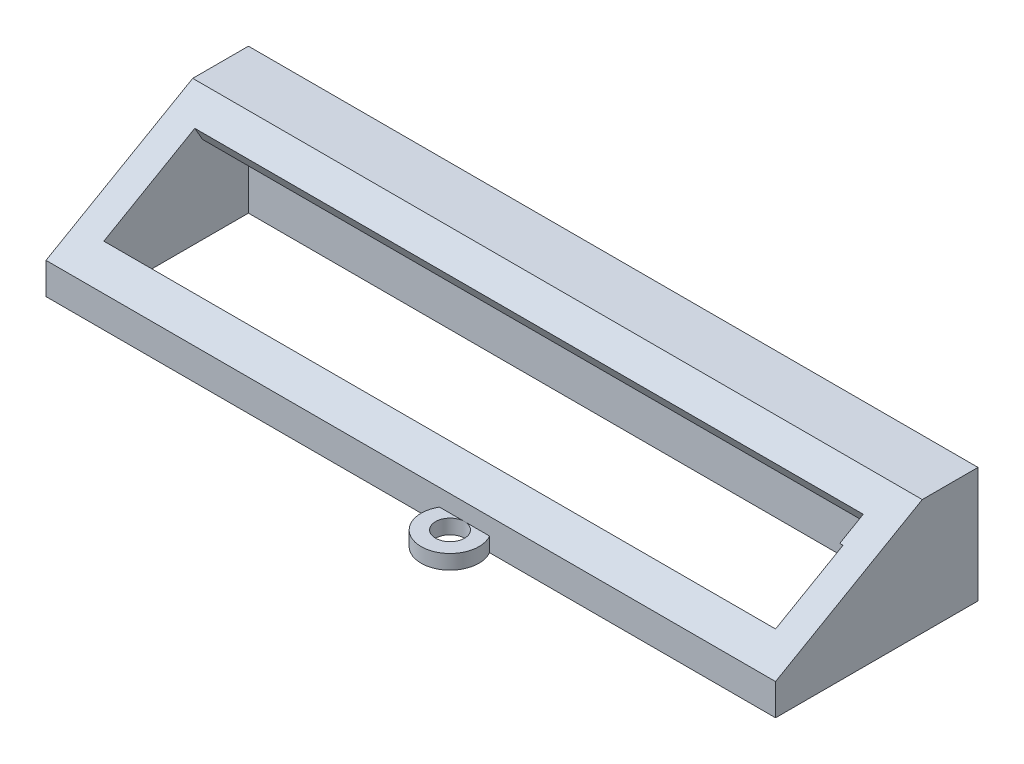
ISO-10303-21;
HEADER;
FILE_DESCRIPTION(('STEP AP214'),'2;1');
FILE_NAME('part.step','',(''),(''),'','','');
FILE_SCHEMA(('AUTOMOTIVE_DESIGN { 1 0 10303 214 1 1 1 1 }'));
ENDSEC;
DATA;
#1=APPLICATION_CONTEXT('core data for automotive mechanical design processes');
#2=APPLICATION_PROTOCOL_DEFINITION('international standard','automotive_design',2000,#1);
#3=PRODUCT_CONTEXT('',#1,'mechanical');
#4=PRODUCT('Part','Part','',(#3));
#5=PRODUCT_RELATED_PRODUCT_CATEGORY('part','',(#4));
#6=PRODUCT_DEFINITION_FORMATION('','',#4);
#7=PRODUCT_DEFINITION_CONTEXT('part definition',#1,'design');
#8=PRODUCT_DEFINITION('design','',#6,#7);
#9=PRODUCT_DEFINITION_SHAPE('','',#8);
#10=(LENGTH_UNIT() NAMED_UNIT(*) SI_UNIT(.MILLI.,.METRE.));
#11=(NAMED_UNIT(*) PLANE_ANGLE_UNIT() SI_UNIT($,.RADIAN.));
#12=(NAMED_UNIT(*) SI_UNIT($,.STERADIAN.) SOLID_ANGLE_UNIT());
#13=UNCERTAINTY_MEASURE_WITH_UNIT(LENGTH_MEASURE(1.E-05),#10,'distance_accuracy_value','');
#14=(GEOMETRIC_REPRESENTATION_CONTEXT(3) GLOBAL_UNCERTAINTY_ASSIGNED_CONTEXT((#13)) GLOBAL_UNIT_ASSIGNED_CONTEXT((#10,
#11,#12)) REPRESENTATION_CONTEXT('',''));
#15=CARTESIAN_POINT('',(0.,0.,0.));
#16=DIRECTION('',(0.,0.,1.));
#17=DIRECTION('',(1.,0.,0.));
#18=AXIS2_PLACEMENT_3D('',#15,#16,#17);
#19=CARTESIAN_POINT('',(252.27,80.,-70.));
#20=DIRECTION('',(-1.,0.,0.));
#21=DIRECTION('',(0.,0.,1.));
#22=AXIS2_PLACEMENT_3D('',#19,#20,#21);
#23=PLANE('',#22);
#24=DIRECTION('',(0.,0.,-1.));
#25=VECTOR('',#24,1.);
#26=CARTESIAN_POINT('',(252.27,80.,-70.));
#27=LINE('',#26,#25);
#28=CARTESIAN_POINT('',(252.27,80.,-31.4570736418901));
#29=VERTEX_POINT('',#28);
#30=CARTESIAN_POINT('',(252.27,80.,-70.));
#31=VERTEX_POINT('',#30);
#32=EDGE_CURVE('E214',#29,#31,#27,.T.);
#33=ORIENTED_EDGE('',*,*,#32,.F.);
#34=DIRECTION('',(0.,0.498039271037889,-0.86715447557171));
#35=VECTOR('',#34,1.);
#36=CARTESIAN_POINT('',(252.27,21.729405288567,70.));
#37=LINE('',#36,#35);
#38=CARTESIAN_POINT('',(252.27,21.729405288567,70.));
#39=VERTEX_POINT('',#38);
#40=EDGE_CURVE('E168',#39,#29,#37,.T.);
#41=ORIENTED_EDGE('',*,*,#40,.F.);
#42=DIRECTION('',(0.,-1.,0.));
#43=VECTOR('',#42,1.);
#44=CARTESIAN_POINT('',(252.27,80.,70.));
#45=LINE('',#44,#43);
#46=CARTESIAN_POINT('',(252.27,0.,70.));
#47=VERTEX_POINT('',#46);
#48=EDGE_CURVE('E222',#39,#47,#45,.T.);
#49=ORIENTED_EDGE('',*,*,#48,.T.);
#50=DIRECTION('',(0.,0.,-1.));
#51=VECTOR('',#50,1.);
#52=CARTESIAN_POINT('',(252.27,0.,-70.));
#53=LINE('',#52,#51);
#54=CARTESIAN_POINT('',(252.27,0.,-70.));
#55=VERTEX_POINT('',#54);
#56=EDGE_CURVE('E207',#47,#55,#53,.T.);
#57=ORIENTED_EDGE('',*,*,#56,.T.);
#58=DIRECTION('',(0.,-1.,0.));
#59=VECTOR('',#58,1.);
#60=CARTESIAN_POINT('',(252.27,80.,-70.));
#61=LINE('',#60,#59);
#62=EDGE_CURVE('E239',#31,#55,#61,.T.);
#63=ORIENTED_EDGE('',*,*,#62,.F.);
#64=EDGE_LOOP('',(#33,#41,#49,#57,#63));
#65=FACE_BOUND('',#64,.T.);
#66=ADVANCED_FACE('F39',(#65),#23,.F.);
#67=CARTESIAN_POINT('',(-252.27,80.,-70.));
#68=DIRECTION('',(0.,0.,1.));
#69=DIRECTION('',(1.,0.,0.));
#70=AXIS2_PLACEMENT_3D('',#67,#68,#69);
#71=PLANE('',#70);
#72=DIRECTION('',(-1.,0.,0.));
#73=VECTOR('',#72,1.);
#74=CARTESIAN_POINT('',(-252.27,0.,-70.));
#75=LINE('',#74,#73);
#76=CARTESIAN_POINT('',(-252.27,0.,-70.));
#77=VERTEX_POINT('',#76);
#78=EDGE_CURVE('E225',#55,#77,#75,.T.);
#79=ORIENTED_EDGE('',*,*,#78,.T.);
#80=DIRECTION('',(0.,-1.,0.));
#81=VECTOR('',#80,1.);
#82=CARTESIAN_POINT('',(-252.27,80.,-70.));
#83=LINE('',#82,#81);
#84=CARTESIAN_POINT('',(-252.27,80.,-70.));
#85=VERTEX_POINT('',#84);
#86=EDGE_CURVE('E236',#85,#77,#83,.T.);
#87=ORIENTED_EDGE('',*,*,#86,.F.);
#88=DIRECTION('',(-1.,0.,0.));
#89=VECTOR('',#88,1.);
#90=CARTESIAN_POINT('',(-252.27,80.,-70.));
#91=LINE('',#90,#89);
#92=EDGE_CURVE('E216',#31,#85,#91,.T.);
#93=ORIENTED_EDGE('',*,*,#92,.F.);
#94=ORIENTED_EDGE('',*,*,#62,.T.);
#95=EDGE_LOOP('',(#79,#87,#93,#94));
#96=FACE_BOUND('',#95,.T.);
#97=ADVANCED_FACE('F284',(#96),#71,.F.);
#98=CARTESIAN_POINT('',(-252.27,80.,-70.));
#99=DIRECTION('',(1.,0.,0.));
#100=DIRECTION('',(0.,0.,-1.));
#101=AXIS2_PLACEMENT_3D('',#98,#99,#100);
#102=PLANE('',#101);
#103=DIRECTION('',(0.,-1.,0.));
#104=VECTOR('',#103,1.);
#105=CARTESIAN_POINT('',(-252.27,80.,70.));
#106=LINE('',#105,#104);
#107=CARTESIAN_POINT('',(-252.27,21.729405288567,70.));
#108=VERTEX_POINT('',#107);
#109=CARTESIAN_POINT('',(-252.27,0.,70.));
#110=VERTEX_POINT('',#109);
#111=EDGE_CURVE('E234',#108,#110,#106,.T.);
#112=ORIENTED_EDGE('',*,*,#111,.F.);
#113=DIRECTION('',(0.,0.498039271037889,-0.86715447557171));
#114=VECTOR('',#113,1.);
#115=CARTESIAN_POINT('',(-252.27,21.729405288567,70.));
#116=LINE('',#115,#114);
#117=CARTESIAN_POINT('',(-252.27,80.,-31.4570736418901));
#118=VERTEX_POINT('',#117);
#119=EDGE_CURVE('E169',#108,#118,#116,.T.);
#120=ORIENTED_EDGE('',*,*,#119,.T.);
#121=DIRECTION('',(0.,0.,1.));
#122=VECTOR('',#121,1.);
#123=CARTESIAN_POINT('',(-252.27,80.,-70.));
#124=LINE('',#123,#122);
#125=EDGE_CURVE('E219',#85,#118,#124,.T.);
#126=ORIENTED_EDGE('',*,*,#125,.F.);
#127=ORIENTED_EDGE('',*,*,#86,.T.);
#128=DIRECTION('',(0.,0.,1.));
#129=VECTOR('',#128,1.);
#130=CARTESIAN_POINT('',(-252.27,0.,-70.));
#131=LINE('',#130,#129);
#132=EDGE_CURVE('E227',#77,#110,#131,.T.);
#133=ORIENTED_EDGE('',*,*,#132,.T.);
#134=EDGE_LOOP('',(#112,#120,#126,#127,#133));
#135=FACE_BOUND('',#134,.T.);
#136=ADVANCED_FACE('F279',(#135),#102,.F.);
#137=CARTESIAN_POINT('',(-252.27,80.,70.));
#138=DIRECTION('',(0.,0.,-1.));
#139=DIRECTION('',(-1.,0.,0.));
#140=AXIS2_PLACEMENT_3D('',#137,#138,#139);
#141=PLANE('',#140);
#142=DIRECTION('',(-1.,0.,0.));
#143=VECTOR('',#142,1.);
#144=CARTESIAN_POINT('',(-252.27,9.99999999999999,70.));
#145=LINE('',#144,#143);
#146=CARTESIAN_POINT('',(54.4822492060079,10.,70.));
#147=VERTEX_POINT('',#146);
#148=CARTESIAN_POINT('',(37.1617411303191,10.,70.));
#149=VERTEX_POINT('',#148);
#150=EDGE_CURVE('E12',#147,#149,#145,.T.);
#151=ORIENTED_EDGE('',*,*,#150,.F.);
#152=DIRECTION('',(0.,-1.,0.));
#153=VECTOR('',#152,1.);
#154=CARTESIAN_POINT('',(54.4822492060079,10.,70.));
#155=LINE('',#154,#153);
#156=CARTESIAN_POINT('',(54.4822492060079,0.,70.));
#157=VERTEX_POINT('',#156);
#158=EDGE_CURVE('E156',#147,#157,#155,.T.);
#159=ORIENTED_EDGE('',*,*,#158,.T.);
#160=DIRECTION('',(1.,0.,0.));
#161=VECTOR('',#160,1.);
#162=CARTESIAN_POINT('',(-252.27,0.,70.));
#163=LINE('',#162,#161);
#164=EDGE_CURVE('E230',#157,#47,#163,.T.);
#165=ORIENTED_EDGE('',*,*,#164,.T.);
#166=ORIENTED_EDGE('',*,*,#48,.F.);
#167=DIRECTION('',(1.,0.,0.));
#168=VECTOR('',#167,1.);
#169=CARTESIAN_POINT('',(-252.27,21.729405288567,70.));
#170=LINE('',#169,#168);
#171=EDGE_CURVE('E172',#108,#39,#170,.T.);
#172=ORIENTED_EDGE('',*,*,#171,.F.);
#173=ORIENTED_EDGE('',*,*,#111,.T.);
#174=CARTESIAN_POINT('',(19.8412330546303,0.,70.));
#175=VERTEX_POINT('',#174);
#176=EDGE_CURVE('E217',#110,#175,#163,.T.);
#177=ORIENTED_EDGE('',*,*,#176,.T.);
#178=DIRECTION('',(0.,-1.,0.));
#179=VECTOR('',#178,1.);
#180=CARTESIAN_POINT('',(19.8412330546303,10.,70.));
#181=LINE('',#180,#179);
#182=CARTESIAN_POINT('',(19.8412330546303,10.,70.));
#183=VERTEX_POINT('',#182);
#184=EDGE_CURVE('E57',#175,#183,#181,.F.);
#185=ORIENTED_EDGE('',*,*,#184,.T.);
#186=EDGE_CURVE('E42',#149,#183,#145,.T.);
#187=ORIENTED_EDGE('',*,*,#186,.F.);
#188=EDGE_LOOP('',(#151,#159,#165,#166,#172,#173,#177,#185,#187));
#189=FACE_BOUND('',#188,.T.);
#190=ADVANCED_FACE('F263',(#189),#141,.F.);
#191=CARTESIAN_POINT('',(0.,80.,0.));
#192=DIRECTION('',(0.,1.,0.));
#193=DIRECTION('',(0.,0.,1.));
#194=AXIS2_PLACEMENT_3D('',#191,#192,#193);
#195=PLANE('',#194);
#196=DIRECTION('',(1.,0.,0.));
#197=VECTOR('',#196,1.);
#198=CARTESIAN_POINT('',(-252.27,80.,-31.4570736418901));
#199=LINE('',#198,#197);
#200=EDGE_CURVE('E174',#118,#29,#199,.T.);
#201=ORIENTED_EDGE('',*,*,#200,.T.);
#202=ORIENTED_EDGE('',*,*,#32,.T.);
#203=ORIENTED_EDGE('',*,*,#92,.T.);
#204=ORIENTED_EDGE('',*,*,#125,.T.);
#205=EDGE_LOOP('',(#201,#202,#203,#204));
#206=FACE_BOUND('',#205,.T.);
#207=ADVANCED_FACE('F286',(#206),#195,.T.);
#208=CARTESIAN_POINT('',(0.,0.,0.));
#209=DIRECTION('',(0.,1.,0.));
#210=DIRECTION('',(0.,0.,1.));
#211=AXIS2_PLACEMENT_3D('',#208,#209,#210);
#212=PLANE('',#211);
#213=ORIENTED_EDGE('',*,*,#164,.F.);
#214=CARTESIAN_POINT('',(37.1617411303191,0.,80.));
#215=DIRECTION('',(0.,-1.,0.));
#216=DIRECTION('',(1.,0.,0.));
#217=AXIS2_PLACEMENT_3D('',#214,#215,#216);
#218=CIRCLE('',#217,20.);
#219=EDGE_CURVE('E255',#157,#175,#218,.T.);
#220=ORIENTED_EDGE('',*,*,#219,.T.);
#221=ORIENTED_EDGE('',*,*,#176,.F.);
#222=ORIENTED_EDGE('',*,*,#132,.F.);
#223=ORIENTED_EDGE('',*,*,#78,.F.);
#224=ORIENTED_EDGE('',*,*,#56,.F.);
#225=EDGE_LOOP('',(#213,#220,#221,#222,#223,#224));
#226=FACE_BOUND('',#225,.T.);
#227=DIRECTION('',(1.,0.,0.));
#228=VECTOR('',#227,1.);
#229=CARTESIAN_POINT('',(232.27,0.,-50.));
#230=LINE('',#229,#228);
#231=CARTESIAN_POINT('',(-232.27,0.,-50.));
#232=VERTEX_POINT('',#231);
#233=CARTESIAN_POINT('',(232.27,0.,-50.));
#234=VERTEX_POINT('',#233);
#235=EDGE_CURVE('E197',#232,#234,#230,.T.);
#236=ORIENTED_EDGE('',*,*,#235,.F.);
#237=DIRECTION('',(0.,0.,-1.));
#238=VECTOR('',#237,1.);
#239=CARTESIAN_POINT('',(-232.27,0.,50.));
#240=LINE('',#239,#238);
#241=CARTESIAN_POINT('',(-232.27,0.,50.));
#242=VERTEX_POINT('',#241);
#243=EDGE_CURVE('E185',#242,#232,#240,.T.);
#244=ORIENTED_EDGE('',*,*,#243,.F.);
#245=DIRECTION('',(-1.,0.,0.));
#246=VECTOR('',#245,1.);
#247=CARTESIAN_POINT('',(232.27,0.,50.));
#248=LINE('',#247,#246);
#249=CARTESIAN_POINT('',(232.27,0.,50.));
#250=VERTEX_POINT('',#249);
#251=EDGE_CURVE('E189',#250,#242,#248,.T.);
#252=ORIENTED_EDGE('',*,*,#251,.F.);
#253=DIRECTION('',(0.,0.,1.));
#254=VECTOR('',#253,1.);
#255=CARTESIAN_POINT('',(232.27,0.,50.));
#256=LINE('',#255,#254);
#257=EDGE_CURVE('E200',#234,#250,#256,.T.);
#258=ORIENTED_EDGE('',*,*,#257,.F.);
#259=EDGE_LOOP('',(#236,#244,#252,#258));
#260=FACE_BOUND('',#259,.T.);
#261=CARTESIAN_POINT('',(37.1617411303191,0.,80.));
#262=DIRECTION('',(0.,-1.,0.));
#263=DIRECTION('',(0.,0.,-1.));
#264=AXIS2_PLACEMENT_3D('',#261,#262,#263);
#265=CIRCLE('',#264,10.);
#266=CARTESIAN_POINT('',(37.1617411303191,0.,70.));
#267=VERTEX_POINT('',#266);
#268=EDGE_CURVE('E260',#267,#267,#265,.T.);
#269=ORIENTED_EDGE('',*,*,#268,.F.);
#270=EDGE_LOOP('',(#269));
#271=FACE_BOUND('',#270,.T.);
#272=ADVANCED_FACE('F267',(#226,#260,#271),#212,.F.);
#273=CARTESIAN_POINT('',(-232.27,60.,50.));
#274=DIRECTION('',(-1.,0.,0.));
#275=DIRECTION('',(0.,0.,1.));
#276=AXIS2_PLACEMENT_3D('',#273,#274,#275);
#277=PLANE('',#276);
#278=DIRECTION('',(0.,0.86715447557171,0.498039271037889));
#279=VECTOR('',#278,1.);
#280=CARTESIAN_POINT('',(-232.27,56.3385513438544,-20.3773628207185));
#281=LINE('',#280,#279);
#282=CARTESIAN_POINT('',(-232.27,60.,-18.2744558173876));
#283=VERTEX_POINT('',#282);
#284=CARTESIAN_POINT('',(-232.27,69.34586847743,-12.9067737551501));
#285=VERTEX_POINT('',#284);
#286=EDGE_CURVE('E148',#283,#285,#281,.T.);
#287=ORIENTED_EDGE('',*,*,#286,.T.);
#288=DIRECTION('',(0.,-0.498039271037889,0.86715447557171));
#289=VECTOR('',#288,1.);
#290=CARTESIAN_POINT('',(-232.27,39.8597024904933,38.4326733325019));
#291=LINE('',#290,#289);
#292=CARTESIAN_POINT('',(-232.27,33.2161538453229,50.));
#293=VERTEX_POINT('',#292);
#294=EDGE_CURVE('E160',#285,#293,#291,.T.);
#295=ORIENTED_EDGE('',*,*,#294,.T.);
#296=DIRECTION('',(0.,-1.,0.));
#297=VECTOR('',#296,1.);
#298=CARTESIAN_POINT('',(-232.27,60.,50.));
#299=LINE('',#298,#297);
#300=EDGE_CURVE('E205',#293,#242,#299,.T.);
#301=ORIENTED_EDGE('',*,*,#300,.T.);
#302=ORIENTED_EDGE('',*,*,#243,.T.);
#303=DIRECTION('',(0.,-1.,0.));
#304=VECTOR('',#303,1.);
#305=CARTESIAN_POINT('',(-232.27,60.,-50.));
#306=LINE('',#305,#304);
#307=CARTESIAN_POINT('',(-232.27,60.,-50.));
#308=VERTEX_POINT('',#307);
#309=EDGE_CURVE('E195',#308,#232,#306,.T.);
#310=ORIENTED_EDGE('',*,*,#309,.F.);
#311=DIRECTION('',(0.,0.,-1.));
#312=VECTOR('',#311,1.);
#313=CARTESIAN_POINT('',(-232.27,60.,50.));
#314=LINE('',#313,#312);
#315=EDGE_CURVE('E186',#283,#308,#314,.T.);
#316=ORIENTED_EDGE('',*,*,#315,.F.);
#317=EDGE_LOOP('',(#287,#295,#301,#302,#310,#316));
#318=FACE_BOUND('',#317,.T.);
#319=ADVANCED_FACE('F311',(#318),#277,.F.);
#320=CARTESIAN_POINT('',(232.27,60.,50.));
#321=DIRECTION('',(0.,0.,1.));
#322=DIRECTION('',(1.,0.,0.));
#323=AXIS2_PLACEMENT_3D('',#320,#321,#322);
#324=PLANE('',#323);
#325=ORIENTED_EDGE('',*,*,#300,.F.);
#326=DIRECTION('',(1.,0.,0.));
#327=VECTOR('',#326,1.);
#328=CARTESIAN_POINT('',(232.27,33.2161538453229,50.));
#329=LINE('',#328,#327);
#330=CARTESIAN_POINT('',(232.27,33.2161538453229,50.));
#331=VERTEX_POINT('',#330);
#332=EDGE_CURVE('E181',#293,#331,#329,.T.);
#333=ORIENTED_EDGE('',*,*,#332,.T.);
#334=DIRECTION('',(0.,-1.,0.));
#335=VECTOR('',#334,1.);
#336=CARTESIAN_POINT('',(232.27,60.,50.));
#337=LINE('',#336,#335);
#338=EDGE_CURVE('E208',#331,#250,#337,.T.);
#339=ORIENTED_EDGE('',*,*,#338,.T.);
#340=ORIENTED_EDGE('',*,*,#251,.T.);
#341=EDGE_LOOP('',(#325,#333,#339,#340));
#342=FACE_BOUND('',#341,.T.);
#343=ADVANCED_FACE('F316',(#342),#324,.F.);
#344=CARTESIAN_POINT('',(232.27,60.,50.));
#345=DIRECTION('',(1.,0.,0.));
#346=DIRECTION('',(0.,0.,-1.));
#347=AXIS2_PLACEMENT_3D('',#344,#345,#346);
#348=PLANE('',#347);
#349=ORIENTED_EDGE('',*,*,#338,.F.);
#350=DIRECTION('',(0.,0.498039271037889,-0.86715447557171));
#351=VECTOR('',#350,1.);
#352=CARTESIAN_POINT('',(232.27,39.8597024904933,38.4326733325019));
#353=LINE('',#352,#351);
#354=CARTESIAN_POINT('',(232.27,60.,3.36566127074454));
#355=VERTEX_POINT('',#354);
#356=EDGE_CURVE('E177',#331,#355,#353,.T.);
#357=ORIENTED_EDGE('',*,*,#356,.T.);
#358=DIRECTION('',(0.,0.,1.));
#359=VECTOR('',#358,1.);
#360=CARTESIAN_POINT('',(232.27,60.,50.));
#361=LINE('',#360,#359);
#362=CARTESIAN_POINT('',(232.27,60.,-50.));
#363=VERTEX_POINT('',#362);
#364=EDGE_CURVE('E192',#363,#355,#361,.T.);
#365=ORIENTED_EDGE('',*,*,#364,.F.);
#366=DIRECTION('',(0.,-1.,0.));
#367=VECTOR('',#366,1.);
#368=CARTESIAN_POINT('',(232.27,60.,-50.));
#369=LINE('',#368,#367);
#370=EDGE_CURVE('E210',#363,#234,#369,.T.);
#371=ORIENTED_EDGE('',*,*,#370,.T.);
#372=ORIENTED_EDGE('',*,*,#257,.T.);
#373=EDGE_LOOP('',(#349,#357,#365,#371,#372));
#374=FACE_BOUND('',#373,.T.);
#375=ADVANCED_FACE('F320',(#374),#348,.F.);
#376=CARTESIAN_POINT('',(232.27,60.,-50.));
#377=DIRECTION('',(0.,0.,-1.));
#378=DIRECTION('',(-1.,0.,0.));
#379=AXIS2_PLACEMENT_3D('',#376,#377,#378);
#380=PLANE('',#379);
#381=ORIENTED_EDGE('',*,*,#235,.T.);
#382=ORIENTED_EDGE('',*,*,#370,.F.);
#383=DIRECTION('',(1.,0.,0.));
#384=VECTOR('',#383,1.);
#385=CARTESIAN_POINT('',(232.27,60.,-50.));
#386=LINE('',#385,#384);
#387=EDGE_CURVE('E188',#308,#363,#386,.T.);
#388=ORIENTED_EDGE('',*,*,#387,.F.);
#389=ORIENTED_EDGE('',*,*,#309,.T.);
#390=EDGE_LOOP('',(#381,#382,#388,#389));
#391=FACE_BOUND('',#390,.T.);
#392=ADVANCED_FACE('F295',(#391),#380,.F.);
#393=CARTESIAN_POINT('',(0.,60.,0.));
#394=DIRECTION('',(0.,1.,0.));
#395=DIRECTION('',(0.,0.,1.));
#396=AXIS2_PLACEMENT_3D('',#393,#394,#395);
#397=PLANE('',#396);
#398=DIRECTION('',(0.,0.,-1.));
#399=VECTOR('',#398,1.);
#400=CARTESIAN_POINT('',(230.,60.,0.));
#401=LINE('',#400,#399);
#402=CARTESIAN_POINT('',(230.,60.,3.36566127074454));
#403=VERTEX_POINT('',#402);
#404=CARTESIAN_POINT('',(230.,60.,-18.2744558173876));
#405=VERTEX_POINT('',#404);
#406=EDGE_CURVE('E153',#403,#405,#401,.T.);
#407=ORIENTED_EDGE('',*,*,#406,.T.);
#408=DIRECTION('',(-1.,0.,0.));
#409=VECTOR('',#408,1.);
#410=CARTESIAN_POINT('',(0.,60.,-18.2744558173876));
#411=LINE('',#410,#409);
#412=EDGE_CURVE('E145',#405,#283,#411,.T.);
#413=ORIENTED_EDGE('',*,*,#412,.T.);
#414=ORIENTED_EDGE('',*,*,#315,.T.);
#415=ORIENTED_EDGE('',*,*,#387,.T.);
#416=ORIENTED_EDGE('',*,*,#364,.T.);
#417=DIRECTION('',(-1.,0.,0.));
#418=VECTOR('',#417,1.);
#419=CARTESIAN_POINT('',(0.,60.,3.36566127074454));
#420=LINE('',#419,#418);
#421=EDGE_CURVE('E241',#355,#403,#420,.T.);
#422=ORIENTED_EDGE('',*,*,#421,.T.);
#423=EDGE_LOOP('',(#407,#413,#414,#415,#416,#422));
#424=FACE_BOUND('',#423,.T.);
#425=ADVANCED_FACE('F288',(#424),#397,.F.);
#426=CARTESIAN_POINT('',(-252.27,21.729405288567,70.));
#427=DIRECTION('',(0.,-0.86715447557171,-0.498039271037889));
#428=DIRECTION('',(0.,0.498039271037889,-0.86715447557171));
#429=AXIS2_PLACEMENT_3D('',#426,#427,#428);
#430=PLANE('',#429);
#431=ORIENTED_EDGE('',*,*,#40,.T.);
#432=ORIENTED_EDGE('',*,*,#200,.F.);
#433=ORIENTED_EDGE('',*,*,#119,.F.);
#434=ORIENTED_EDGE('',*,*,#171,.T.);
#435=EDGE_LOOP('',(#431,#432,#433,#434));
#436=FACE_BOUND('',#435,.T.);
#437=ORIENTED_EDGE('',*,*,#294,.F.);
#438=DIRECTION('',(-1.,0.,0.));
#439=VECTOR('',#438,1.);
#440=CARTESIAN_POINT('',(-232.27,69.34586847743,-12.9067737551501));
#441=LINE('',#440,#439);
#442=CARTESIAN_POINT('',(230.,69.34586847743,-12.9067737551501));
#443=VERTEX_POINT('',#442);
#444=EDGE_CURVE('E143',#443,#285,#441,.T.);
#445=ORIENTED_EDGE('',*,*,#444,.F.);
#446=DIRECTION('',(0.,0.498039271037889,-0.86715447557171));
#447=VECTOR('',#446,1.);
#448=CARTESIAN_POINT('',(230.,60.,3.36566127074455));
#449=LINE('',#448,#447);
#450=EDGE_CURVE('E151',#403,#443,#449,.T.);
#451=ORIENTED_EDGE('',*,*,#450,.F.);
#452=ORIENTED_EDGE('',*,*,#421,.F.);
#453=ORIENTED_EDGE('',*,*,#356,.F.);
#454=ORIENTED_EDGE('',*,*,#332,.F.);
#455=EDGE_LOOP('',(#437,#445,#451,#452,#453,#454));
#456=FACE_BOUND('',#455,.T.);
#457=ADVANCED_FACE('F158',(#436,#456),#430,.F.);
#458=CARTESIAN_POINT('',(-232.27,56.3385513438544,-20.3773628207185));
#459=DIRECTION('',(0.,0.498039271037889,-0.86715447557171));
#460=DIRECTION('',(0.,0.86715447557171,0.498039271037889));
#461=AXIS2_PLACEMENT_3D('',#458,#459,#460);
#462=PLANE('',#461);
#463=DIRECTION('',(0.,0.86715447557171,0.498039271037889));
#464=VECTOR('',#463,1.);
#465=CARTESIAN_POINT('',(230.,56.3385513438544,-20.3773628207185));
#466=LINE('',#465,#464);
#467=EDGE_CURVE('E139',#405,#443,#466,.T.);
#468=ORIENTED_EDGE('',*,*,#467,.T.);
#469=ORIENTED_EDGE('',*,*,#444,.T.);
#470=ORIENTED_EDGE('',*,*,#286,.F.);
#471=ORIENTED_EDGE('',*,*,#412,.F.);
#472=EDGE_LOOP('',(#468,#469,#470,#471));
#473=FACE_BOUND('',#472,.T.);
#474=ADVANCED_FACE('F141',(#473),#462,.F.);
#475=CARTESIAN_POINT('',(230.,46.9926828664243,-4.10492779482378));
#476=DIRECTION('',(1.,0.,0.));
#477=DIRECTION('',(0.,0.,-1.));
#478=AXIS2_PLACEMENT_3D('',#475,#476,#477);
#479=PLANE('',#478);
#480=ORIENTED_EDGE('',*,*,#450,.T.);
#481=ORIENTED_EDGE('',*,*,#467,.F.);
#482=ORIENTED_EDGE('',*,*,#406,.F.);
#483=EDGE_LOOP('',(#480,#481,#482));
#484=FACE_BOUND('',#483,.T.);
#485=ADVANCED_FACE('F152',(#484),#479,.F.);
#486=CARTESIAN_POINT('',(37.1617411303191,10.,80.));
#487=DIRECTION('',(0.,-1.,0.));
#488=DIRECTION('',(0.,0.,-1.));
#489=AXIS2_PLACEMENT_3D('',#486,#487,#488);
#490=PLANE('',#489);
#491=CARTESIAN_POINT('',(37.1617411303191,10.,80.));
#492=DIRECTION('',(0.,-1.,0.));
#493=DIRECTION('',(1.,0.,0.));
#494=AXIS2_PLACEMENT_3D('',#491,#492,#493);
#495=CIRCLE('',#494,20.);
#496=EDGE_CURVE('E248',#147,#183,#495,.T.);
#497=ORIENTED_EDGE('',*,*,#496,.F.);
#498=ORIENTED_EDGE('',*,*,#150,.T.);
#499=CARTESIAN_POINT('',(37.1617411303191,10.,80.));
#500=DIRECTION('',(0.,-1.,0.));
#501=DIRECTION('',(0.,0.,-1.));
#502=AXIS2_PLACEMENT_3D('',#499,#500,#501);
#503=CIRCLE('',#502,10.);
#504=EDGE_CURVE('E250',#149,#149,#503,.T.);
#505=ORIENTED_EDGE('',*,*,#504,.T.);
#506=ORIENTED_EDGE('',*,*,#186,.T.);
#507=EDGE_LOOP('',(#497,#498,#505,#506));
#508=FACE_BOUND('',#507,.T.);
#509=ADVANCED_FACE('F247',(#508),#490,.F.);
#510=CARTESIAN_POINT('',(37.1617411303191,10.,80.));
#511=DIRECTION('',(0.,-1.,0.));
#512=DIRECTION('',(0.,0.,-1.));
#513=AXIS2_PLACEMENT_3D('',#510,#511,#512);
#514=CYLINDRICAL_SURFACE('',#513,20.);
#515=ORIENTED_EDGE('',*,*,#158,.F.);
#516=ORIENTED_EDGE('',*,*,#496,.T.);
#517=ORIENTED_EDGE('',*,*,#184,.F.);
#518=ORIENTED_EDGE('',*,*,#219,.F.);
#519=EDGE_LOOP('',(#515,#516,#517,#518));
#520=FACE_BOUND('',#519,.T.);
#521=ADVANCED_FACE('F252',(#520),#514,.T.);
#522=CARTESIAN_POINT('',(37.1617411303191,10.,80.));
#523=DIRECTION('',(0.,-1.,0.));
#524=DIRECTION('',(0.,0.,-1.));
#525=AXIS2_PLACEMENT_3D('',#522,#523,#524);
#526=CYLINDRICAL_SURFACE('',#525,10.);
#527=ORIENTED_EDGE('',*,*,#268,.T.);
#528=EDGE_LOOP('',(#527));
#529=FACE_BOUND('',#528,.T.);
#530=ORIENTED_EDGE('',*,*,#504,.F.);
#531=EDGE_LOOP('',(#530));
#532=FACE_BOUND('',#531,.T.);
#533=ADVANCED_FACE('F343',(#529,#532),#526,.F.);
#534=CLOSED_SHELL('',(#66,#97,#136,#190,#207,#272,#319,#343,#375,#392,#425,#457,#474,#485,#509,
#521,#533));
#535=MANIFOLD_SOLID_BREP('B2',#534);
#536=ADVANCED_BREP_SHAPE_REPRESENTATION('',(#18,#535),#14);
#537=SHAPE_DEFINITION_REPRESENTATION(#9,#536);
ENDSEC;
END-ISO-10303-21;
